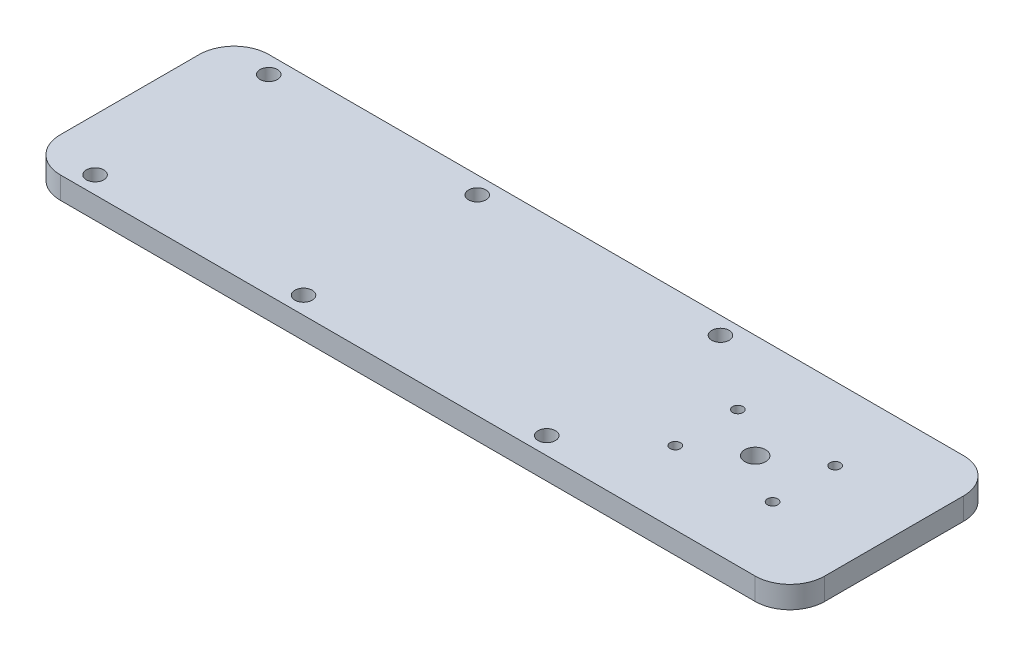
ISO-10303-21;
HEADER;
FILE_DESCRIPTION(('STEP AP214'),'2;1');
FILE_NAME('part.step','',(''),(''),'','','');
FILE_SCHEMA(('AUTOMOTIVE_DESIGN { 1 0 10303 214 1 1 1 1 }'));
ENDSEC;
DATA;
#1=APPLICATION_CONTEXT('core data for automotive mechanical design processes');
#2=APPLICATION_PROTOCOL_DEFINITION('international standard','automotive_design',2000,#1);
#3=PRODUCT_CONTEXT('',#1,'mechanical');
#4=PRODUCT('Part','Part','',(#3));
#5=PRODUCT_RELATED_PRODUCT_CATEGORY('part','',(#4));
#6=PRODUCT_DEFINITION_FORMATION('','',#4);
#7=PRODUCT_DEFINITION_CONTEXT('part definition',#1,'design');
#8=PRODUCT_DEFINITION('design','',#6,#7);
#9=PRODUCT_DEFINITION_SHAPE('','',#8);
#10=(LENGTH_UNIT() NAMED_UNIT(*) SI_UNIT(.MILLI.,.METRE.));
#11=(NAMED_UNIT(*) PLANE_ANGLE_UNIT() SI_UNIT($,.RADIAN.));
#12=(NAMED_UNIT(*) SI_UNIT($,.STERADIAN.) SOLID_ANGLE_UNIT());
#13=UNCERTAINTY_MEASURE_WITH_UNIT(LENGTH_MEASURE(1.E-05),#10,'distance_accuracy_value','');
#14=(GEOMETRIC_REPRESENTATION_CONTEXT(3) GLOBAL_UNCERTAINTY_ASSIGNED_CONTEXT((#13)) GLOBAL_UNIT_ASSIGNED_CONTEXT((#10,
#11,#12)) REPRESENTATION_CONTEXT('',''));
#15=CARTESIAN_POINT('',(0.,0.,0.));
#16=DIRECTION('',(0.,0.,1.));
#17=DIRECTION('',(1.,0.,0.));
#18=AXIS2_PLACEMENT_3D('',#15,#16,#17);
#19=CARTESIAN_POINT('',(-55.,6.35,-30.));
#20=DIRECTION('',(1.,0.,0.));
#21=DIRECTION('',(0.,0.,-1.));
#22=AXIS2_PLACEMENT_3D('',#19,#20,#21);
#23=PLANE('',#22);
#24=DIRECTION('',(0.,0.,1.));
#25=VECTOR('',#24,1.);
#26=CARTESIAN_POINT('',(-55.,0.,-30.));
#27=LINE('',#26,#25);
#28=CARTESIAN_POINT('',(-55.,0.,-20.));
#29=VERTEX_POINT('',#28);
#30=CARTESIAN_POINT('',(-55.,0.,20.));
#31=VERTEX_POINT('',#30);
#32=EDGE_CURVE('E138',#29,#31,#27,.T.);
#33=ORIENTED_EDGE('',*,*,#32,.T.);
#34=DIRECTION('',(0.,-1.,0.));
#35=VECTOR('',#34,1.);
#36=CARTESIAN_POINT('',(-55.,6.35,20.));
#37=LINE('',#36,#35);
#38=CARTESIAN_POINT('',(-55.,6.35,20.));
#39=VERTEX_POINT('',#38);
#40=EDGE_CURVE('E112',#31,#39,#37,.F.);
#41=ORIENTED_EDGE('',*,*,#40,.T.);
#42=DIRECTION('',(0.,0.,1.));
#43=VECTOR('',#42,1.);
#44=CARTESIAN_POINT('',(-55.,6.35,-30.));
#45=LINE('',#44,#43);
#46=CARTESIAN_POINT('',(-55.,6.35,-20.));
#47=VERTEX_POINT('',#46);
#48=EDGE_CURVE('E151',#47,#39,#45,.T.);
#49=ORIENTED_EDGE('',*,*,#48,.F.);
#50=DIRECTION('',(0.,-1.,0.));
#51=VECTOR('',#50,1.);
#52=CARTESIAN_POINT('',(-55.,6.35,-20.));
#53=LINE('',#52,#51);
#54=EDGE_CURVE('E118',#47,#29,#53,.T.);
#55=ORIENTED_EDGE('',*,*,#54,.T.);
#56=EDGE_LOOP('',(#33,#41,#49,#55));
#57=FACE_BOUND('',#56,.T.);
#58=ADVANCED_FACE('F39',(#57),#23,.F.);
#59=CARTESIAN_POINT('',(-55.,6.35,30.));
#60=DIRECTION('',(0.,0.,-1.));
#61=DIRECTION('',(-1.,0.,0.));
#62=AXIS2_PLACEMENT_3D('',#59,#60,#61);
#63=PLANE('',#62);
#64=DIRECTION('',(1.,0.,0.));
#65=VECTOR('',#64,1.);
#66=CARTESIAN_POINT('',(-55.,6.35,30.));
#67=LINE('',#66,#65);
#68=CARTESIAN_POINT('',(-45.,6.35,30.));
#69=VERTEX_POINT('',#68);
#70=CARTESIAN_POINT('',(155.,6.35,30.));
#71=VERTEX_POINT('',#70);
#72=EDGE_CURVE('E128',#69,#71,#67,.T.);
#73=ORIENTED_EDGE('',*,*,#72,.F.);
#74=DIRECTION('',(0.,-1.,0.));
#75=VECTOR('',#74,1.);
#76=CARTESIAN_POINT('',(-45.,6.35,30.));
#77=LINE('',#76,#75);
#78=CARTESIAN_POINT('',(-45.,0.,30.));
#79=VERTEX_POINT('',#78);
#80=EDGE_CURVE('E111',#69,#79,#77,.T.);
#81=ORIENTED_EDGE('',*,*,#80,.T.);
#82=DIRECTION('',(1.,0.,0.));
#83=VECTOR('',#82,1.);
#84=CARTESIAN_POINT('',(-55.,0.,30.));
#85=LINE('',#84,#83);
#86=CARTESIAN_POINT('',(155.,0.,30.));
#87=VERTEX_POINT('',#86);
#88=EDGE_CURVE('E125',#79,#87,#85,.T.);
#89=ORIENTED_EDGE('',*,*,#88,.T.);
#90=DIRECTION('',(0.,-1.,0.));
#91=VECTOR('',#90,1.);
#92=CARTESIAN_POINT('',(155.,6.35,30.));
#93=LINE('',#92,#91);
#94=EDGE_CURVE('E131',#87,#71,#93,.F.);
#95=ORIENTED_EDGE('',*,*,#94,.T.);
#96=EDGE_LOOP('',(#73,#81,#89,#95));
#97=FACE_BOUND('',#96,.T.);
#98=ADVANCED_FACE('F124',(#97),#63,.F.);
#99=CARTESIAN_POINT('',(165.,6.35,-30.));
#100=DIRECTION('',(-1.,0.,0.));
#101=DIRECTION('',(0.,0.,1.));
#102=AXIS2_PLACEMENT_3D('',#99,#100,#101);
#103=PLANE('',#102);
#104=DIRECTION('',(0.,0.,-1.));
#105=VECTOR('',#104,1.);
#106=CARTESIAN_POINT('',(165.,6.35,-30.));
#107=LINE('',#106,#105);
#108=CARTESIAN_POINT('',(165.,6.35,20.));
#109=VERTEX_POINT('',#108);
#110=CARTESIAN_POINT('',(165.,6.35,-20.));
#111=VERTEX_POINT('',#110);
#112=EDGE_CURVE('E187',#109,#111,#107,.T.);
#113=ORIENTED_EDGE('',*,*,#112,.F.);
#114=DIRECTION('',(0.,-1.,0.));
#115=VECTOR('',#114,1.);
#116=CARTESIAN_POINT('',(165.,6.35,20.));
#117=LINE('',#116,#115);
#118=CARTESIAN_POINT('',(165.,0.,20.));
#119=VERTEX_POINT('',#118);
#120=EDGE_CURVE('E11',#109,#119,#117,.T.);
#121=ORIENTED_EDGE('',*,*,#120,.T.);
#122=DIRECTION('',(0.,0.,-1.));
#123=VECTOR('',#122,1.);
#124=CARTESIAN_POINT('',(165.,0.,-30.));
#125=LINE('',#124,#123);
#126=CARTESIAN_POINT('',(165.,0.,-20.));
#127=VERTEX_POINT('',#126);
#128=EDGE_CURVE('E137',#119,#127,#125,.T.);
#129=ORIENTED_EDGE('',*,*,#128,.T.);
#130=DIRECTION('',(0.,-1.,0.));
#131=VECTOR('',#130,1.);
#132=CARTESIAN_POINT('',(165.,6.35,-20.));
#133=LINE('',#132,#131);
#134=EDGE_CURVE('E48',#127,#111,#133,.F.);
#135=ORIENTED_EDGE('',*,*,#134,.T.);
#136=EDGE_LOOP('',(#113,#121,#129,#135));
#137=FACE_BOUND('',#136,.T.);
#138=ADVANCED_FACE('F186',(#137),#103,.F.);
#139=CARTESIAN_POINT('',(-55.,6.35,-30.));
#140=DIRECTION('',(0.,0.,1.));
#141=DIRECTION('',(1.,0.,0.));
#142=AXIS2_PLACEMENT_3D('',#139,#140,#141);
#143=PLANE('',#142);
#144=DIRECTION('',(-1.,0.,0.));
#145=VECTOR('',#144,1.);
#146=CARTESIAN_POINT('',(-55.,0.,-30.));
#147=LINE('',#146,#145);
#148=CARTESIAN_POINT('',(155.,0.,-30.));
#149=VERTEX_POINT('',#148);
#150=CARTESIAN_POINT('',(-45.,0.,-30.));
#151=VERTEX_POINT('',#150);
#152=EDGE_CURVE('E143',#149,#151,#147,.T.);
#153=ORIENTED_EDGE('',*,*,#152,.T.);
#154=DIRECTION('',(0.,-1.,0.));
#155=VECTOR('',#154,1.);
#156=CARTESIAN_POINT('',(-45.,6.35,-30.));
#157=LINE('',#156,#155);
#158=CARTESIAN_POINT('',(-45.,6.35,-30.));
#159=VERTEX_POINT('',#158);
#160=EDGE_CURVE('E55',#151,#159,#157,.F.);
#161=ORIENTED_EDGE('',*,*,#160,.T.);
#162=DIRECTION('',(-1.,0.,0.));
#163=VECTOR('',#162,1.);
#164=CARTESIAN_POINT('',(-55.,6.35,-30.));
#165=LINE('',#164,#163);
#166=CARTESIAN_POINT('',(155.,6.35,-30.));
#167=VERTEX_POINT('',#166);
#168=EDGE_CURVE('E153',#167,#159,#165,.T.);
#169=ORIENTED_EDGE('',*,*,#168,.F.);
#170=DIRECTION('',(0.,-1.,0.));
#171=VECTOR('',#170,1.);
#172=CARTESIAN_POINT('',(155.,6.35,-30.));
#173=LINE('',#172,#171);
#174=EDGE_CURVE('E177',#167,#149,#173,.T.);
#175=ORIENTED_EDGE('',*,*,#174,.T.);
#176=EDGE_LOOP('',(#153,#161,#169,#175));
#177=FACE_BOUND('',#176,.T.);
#178=ADVANCED_FACE('F197',(#177),#143,.F.);
#179=CARTESIAN_POINT('',(0.,6.35,0.));
#180=DIRECTION('',(0.,1.,0.));
#181=DIRECTION('',(0.,0.,1.));
#182=AXIS2_PLACEMENT_3D('',#179,#180,#181);
#183=PLANE('',#182);
#184=CARTESIAN_POINT('',(20.,6.35,25.));
#185=DIRECTION('',(0.,1.,0.));
#186=DIRECTION('',(0.,0.,1.));
#187=AXIS2_PLACEMENT_3D('',#184,#185,#186);
#188=CIRCLE('',#187,2.5);
#189=CARTESIAN_POINT('',(20.,6.35,27.5));
#190=VERTEX_POINT('',#189);
#191=EDGE_CURVE('E293',#190,#190,#188,.T.);
#192=ORIENTED_EDGE('',*,*,#191,.F.);
#193=EDGE_LOOP('',(#192));
#194=FACE_BOUND('',#193,.T.);
#195=CARTESIAN_POINT('',(90.,6.35,25.));
#196=DIRECTION('',(0.,1.,0.));
#197=DIRECTION('',(0.,0.,1.));
#198=AXIS2_PLACEMENT_3D('',#195,#196,#197);
#199=CIRCLE('',#198,2.5);
#200=CARTESIAN_POINT('',(90.,6.35,27.5));
#201=VERTEX_POINT('',#200);
#202=EDGE_CURVE('E285',#201,#201,#199,.T.);
#203=ORIENTED_EDGE('',*,*,#202,.F.);
#204=EDGE_LOOP('',(#203));
#205=FACE_BOUND('',#204,.T.);
#206=CARTESIAN_POINT('',(90.,6.35,-25.));
#207=DIRECTION('',(0.,1.,0.));
#208=DIRECTION('',(0.,0.,1.));
#209=AXIS2_PLACEMENT_3D('',#206,#207,#208);
#210=CIRCLE('',#209,2.5);
#211=CARTESIAN_POINT('',(90.,6.35,-22.5));
#212=VERTEX_POINT('',#211);
#213=EDGE_CURVE('E277',#212,#212,#210,.T.);
#214=ORIENTED_EDGE('',*,*,#213,.F.);
#215=EDGE_LOOP('',(#214));
#216=FACE_BOUND('',#215,.T.);
#217=CARTESIAN_POINT('',(20.,6.35,-25.));
#218=DIRECTION('',(0.,1.,0.));
#219=DIRECTION('',(0.,0.,1.));
#220=AXIS2_PLACEMENT_3D('',#217,#218,#219);
#221=CIRCLE('',#220,2.5);
#222=CARTESIAN_POINT('',(20.,6.35,-22.5));
#223=VERTEX_POINT('',#222);
#224=EDGE_CURVE('E269',#223,#223,#221,.T.);
#225=ORIENTED_EDGE('',*,*,#224,.F.);
#226=EDGE_LOOP('',(#225));
#227=FACE_BOUND('',#226,.T.);
#228=CARTESIAN_POINT('',(-40.,6.35,25.));
#229=DIRECTION('',(0.,1.,0.));
#230=DIRECTION('',(0.,0.,1.));
#231=AXIS2_PLACEMENT_3D('',#228,#229,#230);
#232=CIRCLE('',#231,2.5);
#233=CARTESIAN_POINT('',(-40.,6.35,27.5));
#234=VERTEX_POINT('',#233);
#235=EDGE_CURVE('E261',#234,#234,#232,.T.);
#236=ORIENTED_EDGE('',*,*,#235,.F.);
#237=EDGE_LOOP('',(#236));
#238=FACE_BOUND('',#237,.T.);
#239=CARTESIAN_POINT('',(-40.,6.35,-25.));
#240=DIRECTION('',(0.,1.,0.));
#241=DIRECTION('',(0.,0.,1.));
#242=AXIS2_PLACEMENT_3D('',#239,#240,#241);
#243=CIRCLE('',#242,2.5);
#244=CARTESIAN_POINT('',(-40.,6.35,-22.5));
#245=VERTEX_POINT('',#244);
#246=EDGE_CURVE('E253',#245,#245,#243,.T.);
#247=ORIENTED_EDGE('',*,*,#246,.F.);
#248=EDGE_LOOP('',(#247));
#249=FACE_BOUND('',#248,.T.);
#250=CARTESIAN_POINT('',(139.,6.35,9.00000000000008));
#251=DIRECTION('',(0.,1.,0.));
#252=DIRECTION('',(0.,0.,1.));
#253=AXIS2_PLACEMENT_3D('',#250,#251,#252);
#254=CIRCLE('',#253,1.5);
#255=CARTESIAN_POINT('',(139.,6.35,10.5000000000001));
#256=VERTEX_POINT('',#255);
#257=EDGE_CURVE('E245',#256,#256,#254,.T.);
#258=ORIENTED_EDGE('',*,*,#257,.F.);
#259=EDGE_LOOP('',(#258));
#260=FACE_BOUND('',#259,.T.);
#261=CARTESIAN_POINT('',(111.,6.35,9.00000000000027));
#262=DIRECTION('',(0.,1.,0.));
#263=DIRECTION('',(0.,0.,1.));
#264=AXIS2_PLACEMENT_3D('',#261,#262,#263);
#265=CIRCLE('',#264,1.5);
#266=CARTESIAN_POINT('',(111.,6.35,10.5000000000003));
#267=VERTEX_POINT('',#266);
#268=EDGE_CURVE('E237',#267,#267,#265,.T.);
#269=ORIENTED_EDGE('',*,*,#268,.F.);
#270=EDGE_LOOP('',(#269));
#271=FACE_BOUND('',#270,.T.);
#272=CARTESIAN_POINT('',(111.,6.35,-8.99999999999973));
#273=DIRECTION('',(0.,1.,0.));
#274=DIRECTION('',(0.,0.,1.));
#275=AXIS2_PLACEMENT_3D('',#272,#273,#274);
#276=CIRCLE('',#275,1.5);
#277=CARTESIAN_POINT('',(111.,6.35,-7.49999999999973));
#278=VERTEX_POINT('',#277);
#279=EDGE_CURVE('E229',#278,#278,#276,.T.);
#280=ORIENTED_EDGE('',*,*,#279,.F.);
#281=EDGE_LOOP('',(#280));
#282=FACE_BOUND('',#281,.T.);
#283=CARTESIAN_POINT('',(139.,6.35,-8.99999999999992));
#284=DIRECTION('',(0.,1.,0.));
#285=DIRECTION('',(0.,0.,1.));
#286=AXIS2_PLACEMENT_3D('',#283,#284,#285);
#287=CIRCLE('',#286,1.5);
#288=CARTESIAN_POINT('',(139.,6.35,-7.49999999999992));
#289=VERTEX_POINT('',#288);
#290=EDGE_CURVE('E221',#289,#289,#287,.T.);
#291=ORIENTED_EDGE('',*,*,#290,.F.);
#292=EDGE_LOOP('',(#291));
#293=FACE_BOUND('',#292,.T.);
#294=CARTESIAN_POINT('',(125.,6.35,0.));
#295=DIRECTION('',(0.,1.,0.));
#296=DIRECTION('',(0.,0.,1.));
#297=AXIS2_PLACEMENT_3D('',#294,#295,#296);
#298=CIRCLE('',#297,3.);
#299=CARTESIAN_POINT('',(125.,6.35,3.));
#300=VERTEX_POINT('',#299);
#301=EDGE_CURVE('E213',#300,#300,#298,.T.);
#302=ORIENTED_EDGE('',*,*,#301,.F.);
#303=EDGE_LOOP('',(#302));
#304=FACE_BOUND('',#303,.T.);
#305=ORIENTED_EDGE('',*,*,#48,.T.);
#306=CARTESIAN_POINT('',(-45.,6.35,20.));
#307=DIRECTION('',(0.,1.,0.));
#308=DIRECTION('',(0.,0.,1.));
#309=AXIS2_PLACEMENT_3D('',#306,#307,#308);
#310=CIRCLE('',#309,10.);
#311=EDGE_CURVE('E174',#39,#69,#310,.T.);
#312=ORIENTED_EDGE('',*,*,#311,.T.);
#313=ORIENTED_EDGE('',*,*,#72,.T.);
#314=CARTESIAN_POINT('',(155.,6.35,20.));
#315=DIRECTION('',(0.,1.,0.));
#316=DIRECTION('',(0.,0.,1.));
#317=AXIS2_PLACEMENT_3D('',#314,#315,#316);
#318=CIRCLE('',#317,10.);
#319=EDGE_CURVE('E168',#71,#109,#318,.T.);
#320=ORIENTED_EDGE('',*,*,#319,.T.);
#321=ORIENTED_EDGE('',*,*,#112,.T.);
#322=CARTESIAN_POINT('',(155.,6.35,-20.));
#323=DIRECTION('',(0.,1.,0.));
#324=DIRECTION('',(0.,0.,1.));
#325=AXIS2_PLACEMENT_3D('',#322,#323,#324);
#326=CIRCLE('',#325,10.);
#327=EDGE_CURVE('E62',#111,#167,#326,.T.);
#328=ORIENTED_EDGE('',*,*,#327,.T.);
#329=ORIENTED_EDGE('',*,*,#168,.T.);
#330=CARTESIAN_POINT('',(-45.,6.35,-20.));
#331=DIRECTION('',(0.,1.,0.));
#332=DIRECTION('',(0.,0.,1.));
#333=AXIS2_PLACEMENT_3D('',#330,#331,#332);
#334=CIRCLE('',#333,10.);
#335=EDGE_CURVE('E171',#159,#47,#334,.T.);
#336=ORIENTED_EDGE('',*,*,#335,.T.);
#337=EDGE_LOOP('',(#305,#312,#313,#320,#321,#328,#329,#336));
#338=FACE_BOUND('',#337,.T.);
#339=ADVANCED_FACE('F191',(#194,#205,#216,#227,#238,#249,#260,#271,#282,#293,#304,#338),#183,.T.);
#340=CARTESIAN_POINT('',(0.,0.,0.));
#341=DIRECTION('',(0.,1.,0.));
#342=DIRECTION('',(0.,0.,1.));
#343=AXIS2_PLACEMENT_3D('',#340,#341,#342);
#344=PLANE('',#343);
#345=CARTESIAN_POINT('',(20.,0.,25.));
#346=DIRECTION('',(0.,1.,0.));
#347=DIRECTION('',(0.,0.,1.));
#348=AXIS2_PLACEMENT_3D('',#345,#346,#347);
#349=CIRCLE('',#348,2.5);
#350=CARTESIAN_POINT('',(20.,0.,27.5));
#351=VERTEX_POINT('',#350);
#352=EDGE_CURVE('E289',#351,#351,#349,.T.);
#353=ORIENTED_EDGE('',*,*,#352,.T.);
#354=EDGE_LOOP('',(#353));
#355=FACE_BOUND('',#354,.T.);
#356=CARTESIAN_POINT('',(90.,0.,25.));
#357=DIRECTION('',(0.,1.,0.));
#358=DIRECTION('',(0.,0.,1.));
#359=AXIS2_PLACEMENT_3D('',#356,#357,#358);
#360=CIRCLE('',#359,2.5);
#361=CARTESIAN_POINT('',(90.,0.,27.5));
#362=VERTEX_POINT('',#361);
#363=EDGE_CURVE('E281',#362,#362,#360,.T.);
#364=ORIENTED_EDGE('',*,*,#363,.T.);
#365=EDGE_LOOP('',(#364));
#366=FACE_BOUND('',#365,.T.);
#367=CARTESIAN_POINT('',(90.,0.,-25.));
#368=DIRECTION('',(0.,1.,0.));
#369=DIRECTION('',(0.,0.,1.));
#370=AXIS2_PLACEMENT_3D('',#367,#368,#369);
#371=CIRCLE('',#370,2.5);
#372=CARTESIAN_POINT('',(90.,0.,-22.5));
#373=VERTEX_POINT('',#372);
#374=EDGE_CURVE('E273',#373,#373,#371,.T.);
#375=ORIENTED_EDGE('',*,*,#374,.T.);
#376=EDGE_LOOP('',(#375));
#377=FACE_BOUND('',#376,.T.);
#378=CARTESIAN_POINT('',(20.,0.,-25.));
#379=DIRECTION('',(0.,1.,0.));
#380=DIRECTION('',(0.,0.,1.));
#381=AXIS2_PLACEMENT_3D('',#378,#379,#380);
#382=CIRCLE('',#381,2.5);
#383=CARTESIAN_POINT('',(20.,0.,-22.5));
#384=VERTEX_POINT('',#383);
#385=EDGE_CURVE('E265',#384,#384,#382,.T.);
#386=ORIENTED_EDGE('',*,*,#385,.T.);
#387=EDGE_LOOP('',(#386));
#388=FACE_BOUND('',#387,.T.);
#389=CARTESIAN_POINT('',(-40.,0.,25.));
#390=DIRECTION('',(0.,1.,0.));
#391=DIRECTION('',(0.,0.,1.));
#392=AXIS2_PLACEMENT_3D('',#389,#390,#391);
#393=CIRCLE('',#392,2.5);
#394=CARTESIAN_POINT('',(-40.,0.,27.5));
#395=VERTEX_POINT('',#394);
#396=EDGE_CURVE('E257',#395,#395,#393,.T.);
#397=ORIENTED_EDGE('',*,*,#396,.T.);
#398=EDGE_LOOP('',(#397));
#399=FACE_BOUND('',#398,.T.);
#400=CARTESIAN_POINT('',(-40.,0.,-25.));
#401=DIRECTION('',(0.,1.,0.));
#402=DIRECTION('',(0.,0.,1.));
#403=AXIS2_PLACEMENT_3D('',#400,#401,#402);
#404=CIRCLE('',#403,2.5);
#405=CARTESIAN_POINT('',(-40.,0.,-22.5));
#406=VERTEX_POINT('',#405);
#407=EDGE_CURVE('E249',#406,#406,#404,.T.);
#408=ORIENTED_EDGE('',*,*,#407,.T.);
#409=EDGE_LOOP('',(#408));
#410=FACE_BOUND('',#409,.T.);
#411=CARTESIAN_POINT('',(139.,0.,9.00000000000008));
#412=DIRECTION('',(0.,1.,0.));
#413=DIRECTION('',(0.,0.,1.));
#414=AXIS2_PLACEMENT_3D('',#411,#412,#413);
#415=CIRCLE('',#414,1.5);
#416=CARTESIAN_POINT('',(139.,0.,10.5000000000001));
#417=VERTEX_POINT('',#416);
#418=EDGE_CURVE('E241',#417,#417,#415,.T.);
#419=ORIENTED_EDGE('',*,*,#418,.T.);
#420=EDGE_LOOP('',(#419));
#421=FACE_BOUND('',#420,.T.);
#422=CARTESIAN_POINT('',(111.,0.,9.00000000000027));
#423=DIRECTION('',(0.,1.,0.));
#424=DIRECTION('',(0.,0.,1.));
#425=AXIS2_PLACEMENT_3D('',#422,#423,#424);
#426=CIRCLE('',#425,1.5);
#427=CARTESIAN_POINT('',(111.,0.,10.5000000000003));
#428=VERTEX_POINT('',#427);
#429=EDGE_CURVE('E233',#428,#428,#426,.T.);
#430=ORIENTED_EDGE('',*,*,#429,.T.);
#431=EDGE_LOOP('',(#430));
#432=FACE_BOUND('',#431,.T.);
#433=CARTESIAN_POINT('',(111.,0.,-8.99999999999973));
#434=DIRECTION('',(0.,1.,0.));
#435=DIRECTION('',(0.,0.,1.));
#436=AXIS2_PLACEMENT_3D('',#433,#434,#435);
#437=CIRCLE('',#436,1.5);
#438=CARTESIAN_POINT('',(111.,0.,-7.49999999999973));
#439=VERTEX_POINT('',#438);
#440=EDGE_CURVE('E225',#439,#439,#437,.T.);
#441=ORIENTED_EDGE('',*,*,#440,.T.);
#442=EDGE_LOOP('',(#441));
#443=FACE_BOUND('',#442,.T.);
#444=CARTESIAN_POINT('',(139.,0.,-8.99999999999992));
#445=DIRECTION('',(0.,1.,0.));
#446=DIRECTION('',(0.,0.,1.));
#447=AXIS2_PLACEMENT_3D('',#444,#445,#446);
#448=CIRCLE('',#447,1.5);
#449=CARTESIAN_POINT('',(139.,0.,-7.49999999999992));
#450=VERTEX_POINT('',#449);
#451=EDGE_CURVE('E217',#450,#450,#448,.T.);
#452=ORIENTED_EDGE('',*,*,#451,.T.);
#453=EDGE_LOOP('',(#452));
#454=FACE_BOUND('',#453,.T.);
#455=CARTESIAN_POINT('',(125.,0.,0.));
#456=DIRECTION('',(0.,1.,0.));
#457=DIRECTION('',(0.,0.,1.));
#458=AXIS2_PLACEMENT_3D('',#455,#456,#457);
#459=CIRCLE('',#458,3.);
#460=CARTESIAN_POINT('',(125.,0.,3.));
#461=VERTEX_POINT('',#460);
#462=EDGE_CURVE('E145',#461,#461,#459,.T.);
#463=ORIENTED_EDGE('',*,*,#462,.T.);
#464=EDGE_LOOP('',(#463));
#465=FACE_BOUND('',#464,.T.);
#466=ORIENTED_EDGE('',*,*,#88,.F.);
#467=CARTESIAN_POINT('',(-45.,0.,20.));
#468=DIRECTION('',(0.,1.,0.));
#469=DIRECTION('',(0.,0.,1.));
#470=AXIS2_PLACEMENT_3D('',#467,#468,#469);
#471=CIRCLE('',#470,10.);
#472=EDGE_CURVE('E107',#79,#31,#471,.F.);
#473=ORIENTED_EDGE('',*,*,#472,.T.);
#474=ORIENTED_EDGE('',*,*,#32,.F.);
#475=CARTESIAN_POINT('',(-45.,0.,-20.));
#476=DIRECTION('',(0.,1.,0.));
#477=DIRECTION('',(0.,0.,1.));
#478=AXIS2_PLACEMENT_3D('',#475,#476,#477);
#479=CIRCLE('',#478,10.);
#480=EDGE_CURVE('E119',#29,#151,#479,.F.);
#481=ORIENTED_EDGE('',*,*,#480,.T.);
#482=ORIENTED_EDGE('',*,*,#152,.F.);
#483=CARTESIAN_POINT('',(155.,0.,-20.));
#484=DIRECTION('',(0.,1.,0.));
#485=DIRECTION('',(0.,0.,1.));
#486=AXIS2_PLACEMENT_3D('',#483,#484,#485);
#487=CIRCLE('',#486,10.);
#488=EDGE_CURVE('E130',#149,#127,#487,.F.);
#489=ORIENTED_EDGE('',*,*,#488,.T.);
#490=ORIENTED_EDGE('',*,*,#128,.F.);
#491=CARTESIAN_POINT('',(155.,0.,20.));
#492=DIRECTION('',(0.,1.,0.));
#493=DIRECTION('',(0.,0.,1.));
#494=AXIS2_PLACEMENT_3D('',#491,#492,#493);
#495=CIRCLE('',#494,10.);
#496=EDGE_CURVE('E135',#119,#87,#495,.F.);
#497=ORIENTED_EDGE('',*,*,#496,.T.);
#498=EDGE_LOOP('',(#466,#473,#474,#481,#482,#489,#490,#497));
#499=FACE_BOUND('',#498,.T.);
#500=ADVANCED_FACE('F133',(#355,#366,#377,#388,#399,#410,#421,#432,#443,#454,#465,#499),#344,.F.);
#501=CARTESIAN_POINT('',(-45.,6.35,20.));
#502=DIRECTION('',(0.,-1.,0.));
#503=DIRECTION('',(0.,0.,-1.));
#504=AXIS2_PLACEMENT_3D('',#501,#502,#503);
#505=CYLINDRICAL_SURFACE('',#504,10.);
#506=ORIENTED_EDGE('',*,*,#311,.F.);
#507=ORIENTED_EDGE('',*,*,#40,.F.);
#508=ORIENTED_EDGE('',*,*,#472,.F.);
#509=ORIENTED_EDGE('',*,*,#80,.F.);
#510=EDGE_LOOP('',(#506,#507,#508,#509));
#511=FACE_BOUND('',#510,.T.);
#512=ADVANCED_FACE('F110',(#511),#505,.T.);
#513=CARTESIAN_POINT('',(-45.,6.35,-20.));
#514=DIRECTION('',(0.,-1.,0.));
#515=DIRECTION('',(0.,0.,-1.));
#516=AXIS2_PLACEMENT_3D('',#513,#514,#515);
#517=CYLINDRICAL_SURFACE('',#516,10.);
#518=ORIENTED_EDGE('',*,*,#335,.F.);
#519=ORIENTED_EDGE('',*,*,#160,.F.);
#520=ORIENTED_EDGE('',*,*,#480,.F.);
#521=ORIENTED_EDGE('',*,*,#54,.F.);
#522=EDGE_LOOP('',(#518,#519,#520,#521));
#523=FACE_BOUND('',#522,.T.);
#524=ADVANCED_FACE('F201',(#523),#517,.T.);
#525=CARTESIAN_POINT('',(155.,6.35,20.));
#526=DIRECTION('',(0.,-1.,0.));
#527=DIRECTION('',(0.,0.,-1.));
#528=AXIS2_PLACEMENT_3D('',#525,#526,#527);
#529=CYLINDRICAL_SURFACE('',#528,10.);
#530=ORIENTED_EDGE('',*,*,#319,.F.);
#531=ORIENTED_EDGE('',*,*,#94,.F.);
#532=ORIENTED_EDGE('',*,*,#496,.F.);
#533=ORIENTED_EDGE('',*,*,#120,.F.);
#534=EDGE_LOOP('',(#530,#531,#532,#533));
#535=FACE_BOUND('',#534,.T.);
#536=ADVANCED_FACE('F335',(#535),#529,.T.);
#537=CARTESIAN_POINT('',(155.,6.35,-20.));
#538=DIRECTION('',(0.,-1.,0.));
#539=DIRECTION('',(0.,0.,-1.));
#540=AXIS2_PLACEMENT_3D('',#537,#538,#539);
#541=CYLINDRICAL_SURFACE('',#540,10.);
#542=ORIENTED_EDGE('',*,*,#327,.F.);
#543=ORIENTED_EDGE('',*,*,#134,.F.);
#544=ORIENTED_EDGE('',*,*,#488,.F.);
#545=ORIENTED_EDGE('',*,*,#174,.F.);
#546=EDGE_LOOP('',(#542,#543,#544,#545));
#547=FACE_BOUND('',#546,.T.);
#548=ADVANCED_FACE('F41',(#547),#541,.T.);
#549=CARTESIAN_POINT('',(125.,6.35,0.));
#550=DIRECTION('',(0.,1.,0.));
#551=DIRECTION('',(0.,0.,1.));
#552=AXIS2_PLACEMENT_3D('',#549,#550,#551);
#553=CYLINDRICAL_SURFACE('',#552,3.);
#554=ORIENTED_EDGE('',*,*,#462,.F.);
#555=EDGE_LOOP('',(#554));
#556=FACE_BOUND('',#555,.T.);
#557=ORIENTED_EDGE('',*,*,#301,.T.);
#558=EDGE_LOOP('',(#557));
#559=FACE_BOUND('',#558,.T.);
#560=ADVANCED_FACE('F323',(#556,#559),#553,.F.);
#561=CARTESIAN_POINT('',(139.,6.35,-8.99999999999992));
#562=DIRECTION('',(0.,1.,0.));
#563=DIRECTION('',(0.,0.,1.));
#564=AXIS2_PLACEMENT_3D('',#561,#562,#563);
#565=CYLINDRICAL_SURFACE('',#564,1.5);
#566=ORIENTED_EDGE('',*,*,#451,.F.);
#567=EDGE_LOOP('',(#566));
#568=FACE_BOUND('',#567,.T.);
#569=ORIENTED_EDGE('',*,*,#290,.T.);
#570=EDGE_LOOP('',(#569));
#571=FACE_BOUND('',#570,.T.);
#572=ADVANCED_FACE('F325',(#568,#571),#565,.F.);
#573=CARTESIAN_POINT('',(111.,6.35,-8.99999999999973));
#574=DIRECTION('',(0.,1.,0.));
#575=DIRECTION('',(0.,0.,1.));
#576=AXIS2_PLACEMENT_3D('',#573,#574,#575);
#577=CYLINDRICAL_SURFACE('',#576,1.5);
#578=ORIENTED_EDGE('',*,*,#440,.F.);
#579=EDGE_LOOP('',(#578));
#580=FACE_BOUND('',#579,.T.);
#581=ORIENTED_EDGE('',*,*,#279,.T.);
#582=EDGE_LOOP('',(#581));
#583=FACE_BOUND('',#582,.T.);
#584=ADVANCED_FACE('F332',(#580,#583),#577,.F.);
#585=CARTESIAN_POINT('',(111.,6.35,9.00000000000027));
#586=DIRECTION('',(0.,1.,0.));
#587=DIRECTION('',(0.,0.,1.));
#588=AXIS2_PLACEMENT_3D('',#585,#586,#587);
#589=CYLINDRICAL_SURFACE('',#588,1.5);
#590=ORIENTED_EDGE('',*,*,#429,.F.);
#591=EDGE_LOOP('',(#590));
#592=FACE_BOUND('',#591,.T.);
#593=ORIENTED_EDGE('',*,*,#268,.T.);
#594=EDGE_LOOP('',(#593));
#595=FACE_BOUND('',#594,.T.);
#596=ADVANCED_FACE('F377',(#592,#595),#589,.F.);
#597=CARTESIAN_POINT('',(139.,6.35,9.00000000000008));
#598=DIRECTION('',(0.,1.,0.));
#599=DIRECTION('',(0.,0.,1.));
#600=AXIS2_PLACEMENT_3D('',#597,#598,#599);
#601=CYLINDRICAL_SURFACE('',#600,1.5);
#602=ORIENTED_EDGE('',*,*,#418,.F.);
#603=EDGE_LOOP('',(#602));
#604=FACE_BOUND('',#603,.T.);
#605=ORIENTED_EDGE('',*,*,#257,.T.);
#606=EDGE_LOOP('',(#605));
#607=FACE_BOUND('',#606,.T.);
#608=ADVANCED_FACE('F387',(#604,#607),#601,.F.);
#609=CARTESIAN_POINT('',(-40.,6.35,-25.));
#610=DIRECTION('',(0.,1.,0.));
#611=DIRECTION('',(0.,0.,1.));
#612=AXIS2_PLACEMENT_3D('',#609,#610,#611);
#613=CYLINDRICAL_SURFACE('',#612,2.5);
#614=ORIENTED_EDGE('',*,*,#407,.F.);
#615=EDGE_LOOP('',(#614));
#616=FACE_BOUND('',#615,.T.);
#617=ORIENTED_EDGE('',*,*,#246,.T.);
#618=EDGE_LOOP('',(#617));
#619=FACE_BOUND('',#618,.T.);
#620=ADVANCED_FACE('F397',(#616,#619),#613,.F.);
#621=CARTESIAN_POINT('',(-40.,6.35,25.));
#622=DIRECTION('',(0.,1.,0.));
#623=DIRECTION('',(0.,0.,1.));
#624=AXIS2_PLACEMENT_3D('',#621,#622,#623);
#625=CYLINDRICAL_SURFACE('',#624,2.5);
#626=ORIENTED_EDGE('',*,*,#396,.F.);
#627=EDGE_LOOP('',(#626));
#628=FACE_BOUND('',#627,.T.);
#629=ORIENTED_EDGE('',*,*,#235,.T.);
#630=EDGE_LOOP('',(#629));
#631=FACE_BOUND('',#630,.T.);
#632=ADVANCED_FACE('F425',(#628,#631),#625,.F.);
#633=CARTESIAN_POINT('',(20.,6.35,-25.));
#634=DIRECTION('',(0.,1.,0.));
#635=DIRECTION('',(0.,0.,1.));
#636=AXIS2_PLACEMENT_3D('',#633,#634,#635);
#637=CYLINDRICAL_SURFACE('',#636,2.5);
#638=ORIENTED_EDGE('',*,*,#385,.F.);
#639=EDGE_LOOP('',(#638));
#640=FACE_BOUND('',#639,.T.);
#641=ORIENTED_EDGE('',*,*,#224,.T.);
#642=EDGE_LOOP('',(#641));
#643=FACE_BOUND('',#642,.T.);
#644=ADVANCED_FACE('F435',(#640,#643),#637,.F.);
#645=CARTESIAN_POINT('',(90.,6.35,-25.));
#646=DIRECTION('',(0.,1.,0.));
#647=DIRECTION('',(0.,0.,1.));
#648=AXIS2_PLACEMENT_3D('',#645,#646,#647);
#649=CYLINDRICAL_SURFACE('',#648,2.5);
#650=ORIENTED_EDGE('',*,*,#374,.F.);
#651=EDGE_LOOP('',(#650));
#652=FACE_BOUND('',#651,.T.);
#653=ORIENTED_EDGE('',*,*,#213,.T.);
#654=EDGE_LOOP('',(#653));
#655=FACE_BOUND('',#654,.T.);
#656=ADVANCED_FACE('F445',(#652,#655),#649,.F.);
#657=CARTESIAN_POINT('',(90.,6.35,25.));
#658=DIRECTION('',(0.,1.,0.));
#659=DIRECTION('',(0.,0.,1.));
#660=AXIS2_PLACEMENT_3D('',#657,#658,#659);
#661=CYLINDRICAL_SURFACE('',#660,2.5);
#662=ORIENTED_EDGE('',*,*,#363,.F.);
#663=EDGE_LOOP('',(#662));
#664=FACE_BOUND('',#663,.T.);
#665=ORIENTED_EDGE('',*,*,#202,.T.);
#666=EDGE_LOOP('',(#665));
#667=FACE_BOUND('',#666,.T.);
#668=ADVANCED_FACE('F455',(#664,#667),#661,.F.);
#669=CARTESIAN_POINT('',(20.,6.35,25.));
#670=DIRECTION('',(0.,1.,0.));
#671=DIRECTION('',(0.,0.,1.));
#672=AXIS2_PLACEMENT_3D('',#669,#670,#671);
#673=CYLINDRICAL_SURFACE('',#672,2.5);
#674=ORIENTED_EDGE('',*,*,#352,.F.);
#675=EDGE_LOOP('',(#674));
#676=FACE_BOUND('',#675,.T.);
#677=ORIENTED_EDGE('',*,*,#191,.T.);
#678=EDGE_LOOP('',(#677));
#679=FACE_BOUND('',#678,.T.);
#680=ADVANCED_FACE('F298',(#676,#679),#673,.F.);
#681=CLOSED_SHELL('',(#58,#98,#138,#178,#339,#500,#512,#524,#536,#548,#560,#572,#584,#596,#608,
#620,#632,#644,#656,#668,#680));
#682=MANIFOLD_SOLID_BREP('B2',#681);
#683=ADVANCED_BREP_SHAPE_REPRESENTATION('',(#18,#682),#14);
#684=SHAPE_DEFINITION_REPRESENTATION(#9,#683);
ENDSEC;
END-ISO-10303-21;
